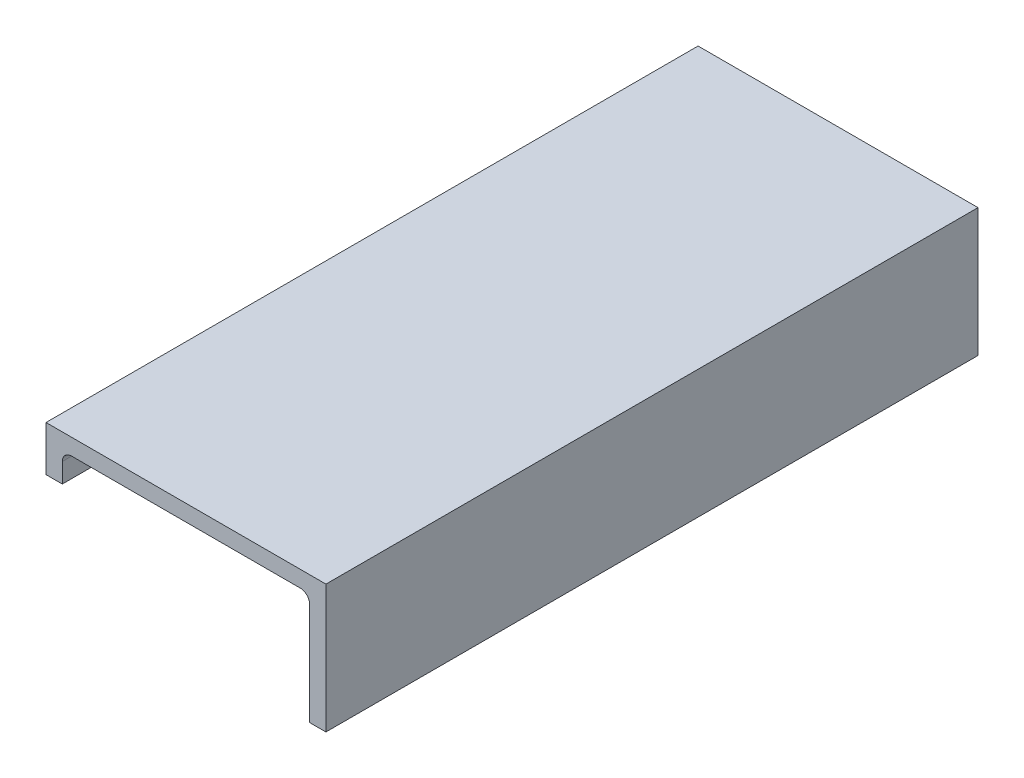
ISO-10303-21;
HEADER;
FILE_DESCRIPTION(('STEP AP214'),'2;1');
FILE_NAME('part.step','',(''),(''),'','','');
FILE_SCHEMA(('AUTOMOTIVE_DESIGN { 1 0 10303 214 1 1 1 1 }'));
ENDSEC;
DATA;
#1=APPLICATION_CONTEXT('core data for automotive mechanical design processes');
#2=APPLICATION_PROTOCOL_DEFINITION('international standard','automotive_design',2000,#1);
#3=PRODUCT_CONTEXT('',#1,'mechanical');
#4=PRODUCT('Part','Part','',(#3));
#5=PRODUCT_RELATED_PRODUCT_CATEGORY('part','',(#4));
#6=PRODUCT_DEFINITION_FORMATION('','',#4);
#7=PRODUCT_DEFINITION_CONTEXT('part definition',#1,'design');
#8=PRODUCT_DEFINITION('design','',#6,#7);
#9=PRODUCT_DEFINITION_SHAPE('','',#8);
#10=(LENGTH_UNIT() NAMED_UNIT(*) SI_UNIT(.MILLI.,.METRE.));
#11=(NAMED_UNIT(*) PLANE_ANGLE_UNIT() SI_UNIT($,.RADIAN.));
#12=(NAMED_UNIT(*) SI_UNIT($,.STERADIAN.) SOLID_ANGLE_UNIT());
#13=UNCERTAINTY_MEASURE_WITH_UNIT(LENGTH_MEASURE(1.E-05),#10,'distance_accuracy_value','');
#14=(GEOMETRIC_REPRESENTATION_CONTEXT(3) GLOBAL_UNCERTAINTY_ASSIGNED_CONTEXT((#13)) GLOBAL_UNIT_ASSIGNED_CONTEXT((#10,
#11,#12)) REPRESENTATION_CONTEXT('',''));
#15=CARTESIAN_POINT('',(0.,0.,0.));
#16=DIRECTION('',(0.,0.,1.));
#17=DIRECTION('',(1.,0.,0.));
#18=AXIS2_PLACEMENT_3D('',#15,#16,#17);
#19=CARTESIAN_POINT('',(-38.1635,0.,177.8));
#20=DIRECTION('',(1.,0.,0.));
#21=DIRECTION('',(0.,0.,-1.));
#22=AXIS2_PLACEMENT_3D('',#19,#20,#21);
#23=PLANE('',#22);
#24=DIRECTION('',(0.,-1.,0.));
#25=VECTOR('',#24,1.);
#26=CARTESIAN_POINT('',(-38.1635,0.,0.));
#27=LINE('',#26,#25);
#28=CARTESIAN_POINT('',(-38.1635,0.,0.));
#29=VERTEX_POINT('',#28);
#30=CARTESIAN_POINT('',(-38.1635,-12.319,0.));
#31=VERTEX_POINT('',#30);
#32=EDGE_CURVE('E189',#29,#31,#27,.T.);
#33=ORIENTED_EDGE('',*,*,#32,.T.);
#34=DIRECTION('',(0.,0.,-1.));
#35=VECTOR('',#34,1.);
#36=CARTESIAN_POINT('',(-38.1635,-12.319,177.8));
#37=LINE('',#36,#35);
#38=CARTESIAN_POINT('',(-38.1635,-12.319,177.8));
#39=VERTEX_POINT('',#38);
#40=EDGE_CURVE('E115',#39,#31,#37,.T.);
#41=ORIENTED_EDGE('',*,*,#40,.F.);
#42=DIRECTION('',(0.,-1.,0.));
#43=VECTOR('',#42,1.);
#44=CARTESIAN_POINT('',(-38.1635,0.,177.8));
#45=LINE('',#44,#43);
#46=CARTESIAN_POINT('',(-38.1635,0.,177.8));
#47=VERTEX_POINT('',#46);
#48=EDGE_CURVE('E110',#47,#39,#45,.T.);
#49=ORIENTED_EDGE('',*,*,#48,.F.);
#50=DIRECTION('',(0.,0.,-1.));
#51=VECTOR('',#50,1.);
#52=CARTESIAN_POINT('',(-38.1635,0.,177.8));
#53=LINE('',#52,#51);
#54=EDGE_CURVE('E113',#47,#29,#53,.T.);
#55=ORIENTED_EDGE('',*,*,#54,.T.);
#56=EDGE_LOOP('',(#33,#41,#49,#55));
#57=FACE_BOUND('',#56,.T.);
#58=ADVANCED_FACE('F33',(#57),#23,.F.);
#59=CARTESIAN_POINT('',(-38.1635,-12.319,177.8));
#60=DIRECTION('',(0.,1.,0.));
#61=DIRECTION('',(0.,0.,1.));
#62=AXIS2_PLACEMENT_3D('',#59,#60,#61);
#63=PLANE('',#62);
#64=DIRECTION('',(1.,0.,0.));
#65=VECTOR('',#64,1.);
#66=CARTESIAN_POINT('',(-38.1635,-12.319,0.));
#67=LINE('',#66,#65);
#68=CARTESIAN_POINT('',(-33.7185,-12.319,0.));
#69=VERTEX_POINT('',#68);
#70=EDGE_CURVE('E168',#31,#69,#67,.T.);
#71=ORIENTED_EDGE('',*,*,#70,.T.);
#72=DIRECTION('',(0.,0.,-1.));
#73=VECTOR('',#72,1.);
#74=CARTESIAN_POINT('',(-33.7185,-12.319,177.8));
#75=LINE('',#74,#73);
#76=CARTESIAN_POINT('',(-33.7185,-12.319,177.8));
#77=VERTEX_POINT('',#76);
#78=EDGE_CURVE('E138',#77,#69,#75,.T.);
#79=ORIENTED_EDGE('',*,*,#78,.F.);
#80=DIRECTION('',(1.,0.,0.));
#81=VECTOR('',#80,1.);
#82=CARTESIAN_POINT('',(-38.1635,-12.319,177.8));
#83=LINE('',#82,#81);
#84=EDGE_CURVE('E118',#39,#77,#83,.T.);
#85=ORIENTED_EDGE('',*,*,#84,.F.);
#86=ORIENTED_EDGE('',*,*,#40,.T.);
#87=EDGE_LOOP('',(#71,#79,#85,#86));
#88=FACE_BOUND('',#87,.T.);
#89=ADVANCED_FACE('F199',(#88),#63,.F.);
#90=CARTESIAN_POINT('',(-33.7185,-4.445,177.8));
#91=DIRECTION('',(-1.,0.,0.));
#92=DIRECTION('',(0.,0.,1.));
#93=AXIS2_PLACEMENT_3D('',#90,#91,#92);
#94=PLANE('',#93);
#95=DIRECTION('',(0.,1.,0.));
#96=VECTOR('',#95,1.);
#97=CARTESIAN_POINT('',(-33.7185,-4.445,0.));
#98=LINE('',#97,#96);
#99=CARTESIAN_POINT('',(-33.7185,-6.985,0.));
#100=VERTEX_POINT('',#99);
#101=EDGE_CURVE('E164',#69,#100,#98,.T.);
#102=ORIENTED_EDGE('',*,*,#101,.T.);
#103=DIRECTION('',(0.,0.,-1.));
#104=VECTOR('',#103,1.);
#105=CARTESIAN_POINT('',(-33.7185,-6.985,177.8));
#106=LINE('',#105,#104);
#107=CARTESIAN_POINT('',(-33.7185,-6.985,177.8));
#108=VERTEX_POINT('',#107);
#109=EDGE_CURVE('E48',#100,#108,#106,.F.);
#110=ORIENTED_EDGE('',*,*,#109,.T.);
#111=DIRECTION('',(0.,1.,0.));
#112=VECTOR('',#111,1.);
#113=CARTESIAN_POINT('',(-33.7185,-4.445,177.8));
#114=LINE('',#113,#112);
#115=EDGE_CURVE('E186',#77,#108,#114,.T.);
#116=ORIENTED_EDGE('',*,*,#115,.F.);
#117=ORIENTED_EDGE('',*,*,#78,.T.);
#118=EDGE_LOOP('',(#102,#110,#116,#117));
#119=FACE_BOUND('',#118,.T.);
#120=ADVANCED_FACE('F185',(#119),#94,.F.);
#121=CARTESIAN_POINT('',(33.7185,-4.44499999999999,177.8));
#122=DIRECTION('',(0.,1.,0.));
#123=DIRECTION('',(-1.,0.,0.));
#124=AXIS2_PLACEMENT_3D('',#121,#122,#123);
#125=PLANE('',#124);
#126=DIRECTION('',(1.,0.,0.));
#127=VECTOR('',#126,1.);
#128=CARTESIAN_POINT('',(33.7185,-4.44499999999999,177.8));
#129=LINE('',#128,#127);
#130=CARTESIAN_POINT('',(-31.1785,-4.445,177.8));
#131=VERTEX_POINT('',#130);
#132=CARTESIAN_POINT('',(31.1785,-4.44499999999999,177.8));
#133=VERTEX_POINT('',#132);
#134=EDGE_CURVE('E157',#131,#133,#129,.T.);
#135=ORIENTED_EDGE('',*,*,#134,.F.);
#136=DIRECTION('',(0.,0.,-1.));
#137=VECTOR('',#136,1.);
#138=CARTESIAN_POINT('',(-31.1785,-4.445,0.));
#139=LINE('',#138,#137);
#140=CARTESIAN_POINT('',(-31.1785,-4.445,0.));
#141=VERTEX_POINT('',#140);
#142=EDGE_CURVE('E149',#131,#141,#139,.T.);
#143=ORIENTED_EDGE('',*,*,#142,.T.);
#144=DIRECTION('',(1.,0.,0.));
#145=VECTOR('',#144,1.);
#146=CARTESIAN_POINT('',(33.7185,-4.44499999999999,0.));
#147=LINE('',#146,#145);
#148=CARTESIAN_POINT('',(31.1785,-4.44499999999999,0.));
#149=VERTEX_POINT('',#148);
#150=EDGE_CURVE('E156',#141,#149,#147,.T.);
#151=ORIENTED_EDGE('',*,*,#150,.T.);
#152=DIRECTION('',(0.,0.,-1.));
#153=VECTOR('',#152,1.);
#154=CARTESIAN_POINT('',(31.1785,-4.44499999999999,177.8));
#155=LINE('',#154,#153);
#156=EDGE_CURVE('E136',#149,#133,#155,.F.);
#157=ORIENTED_EDGE('',*,*,#156,.T.);
#158=EDGE_LOOP('',(#135,#143,#151,#157));
#159=FACE_BOUND('',#158,.T.);
#160=ADVANCED_FACE('F155',(#159),#125,.F.);
#161=CARTESIAN_POINT('',(33.7185,-34.925,177.8));
#162=DIRECTION('',(1.,0.,0.));
#163=DIRECTION('',(0.,0.,-1.));
#164=AXIS2_PLACEMENT_3D('',#161,#162,#163);
#165=PLANE('',#164);
#166=DIRECTION('',(0.,-1.,0.));
#167=VECTOR('',#166,1.);
#168=CARTESIAN_POINT('',(33.7185,-34.925,177.8));
#169=LINE('',#168,#167);
#170=CARTESIAN_POINT('',(33.7185,-6.985,177.8));
#171=VERTEX_POINT('',#170);
#172=CARTESIAN_POINT('',(33.7185,-34.925,177.8));
#173=VERTEX_POINT('',#172);
#174=EDGE_CURVE('E195',#171,#173,#169,.T.);
#175=ORIENTED_EDGE('',*,*,#174,.F.);
#176=DIRECTION('',(0.,0.,-1.));
#177=VECTOR('',#176,1.);
#178=CARTESIAN_POINT('',(33.7185,-6.98499999999999,0.));
#179=LINE('',#178,#177);
#180=CARTESIAN_POINT('',(33.7185,-6.985,0.));
#181=VERTEX_POINT('',#180);
#182=EDGE_CURVE('E133',#171,#181,#179,.T.);
#183=ORIENTED_EDGE('',*,*,#182,.T.);
#184=DIRECTION('',(0.,-1.,0.));
#185=VECTOR('',#184,1.);
#186=CARTESIAN_POINT('',(33.7185,-34.925,0.));
#187=LINE('',#186,#185);
#188=CARTESIAN_POINT('',(33.7185,-34.925,0.));
#189=VERTEX_POINT('',#188);
#190=EDGE_CURVE('E163',#181,#189,#187,.T.);
#191=ORIENTED_EDGE('',*,*,#190,.T.);
#192=DIRECTION('',(0.,0.,-1.));
#193=VECTOR('',#192,1.);
#194=CARTESIAN_POINT('',(33.7185,-34.925,177.8));
#195=LINE('',#194,#193);
#196=EDGE_CURVE('E181',#173,#189,#195,.T.);
#197=ORIENTED_EDGE('',*,*,#196,.F.);
#198=EDGE_LOOP('',(#175,#183,#191,#197));
#199=FACE_BOUND('',#198,.T.);
#200=ADVANCED_FACE('F222',(#199),#165,.F.);
#201=CARTESIAN_POINT('',(38.1635,-34.925,177.8));
#202=DIRECTION('',(0.,1.,0.));
#203=DIRECTION('',(0.,0.,1.));
#204=AXIS2_PLACEMENT_3D('',#201,#202,#203);
#205=PLANE('',#204);
#206=DIRECTION('',(1.,0.,0.));
#207=VECTOR('',#206,1.);
#208=CARTESIAN_POINT('',(38.1635,-34.925,0.));
#209=LINE('',#208,#207);
#210=CARTESIAN_POINT('',(38.1635,-34.925,0.));
#211=VERTEX_POINT('',#210);
#212=EDGE_CURVE('E166',#189,#211,#209,.T.);
#213=ORIENTED_EDGE('',*,*,#212,.T.);
#214=DIRECTION('',(0.,0.,-1.));
#215=VECTOR('',#214,1.);
#216=CARTESIAN_POINT('',(38.1635,-34.925,177.8));
#217=LINE('',#216,#215);
#218=CARTESIAN_POINT('',(38.1635,-34.925,177.8));
#219=VERTEX_POINT('',#218);
#220=EDGE_CURVE('E178',#219,#211,#217,.T.);
#221=ORIENTED_EDGE('',*,*,#220,.F.);
#222=DIRECTION('',(1.,0.,0.));
#223=VECTOR('',#222,1.);
#224=CARTESIAN_POINT('',(38.1635,-34.925,177.8));
#225=LINE('',#224,#223);
#226=EDGE_CURVE('E193',#173,#219,#225,.T.);
#227=ORIENTED_EDGE('',*,*,#226,.F.);
#228=ORIENTED_EDGE('',*,*,#196,.T.);
#229=EDGE_LOOP('',(#213,#221,#227,#228));
#230=FACE_BOUND('',#229,.T.);
#231=ADVANCED_FACE('F227',(#230),#205,.F.);
#232=CARTESIAN_POINT('',(38.1635,0.,177.8));
#233=DIRECTION('',(-1.,0.,0.));
#234=DIRECTION('',(0.,0.,1.));
#235=AXIS2_PLACEMENT_3D('',#232,#233,#234);
#236=PLANE('',#235);
#237=DIRECTION('',(0.,1.,0.));
#238=VECTOR('',#237,1.);
#239=CARTESIAN_POINT('',(38.1635,0.,0.));
#240=LINE('',#239,#238);
#241=CARTESIAN_POINT('',(38.1635,0.,0.));
#242=VERTEX_POINT('',#241);
#243=EDGE_CURVE('E173',#211,#242,#240,.T.);
#244=ORIENTED_EDGE('',*,*,#243,.T.);
#245=DIRECTION('',(0.,0.,-1.));
#246=VECTOR('',#245,1.);
#247=CARTESIAN_POINT('',(38.1635,0.,177.8));
#248=LINE('',#247,#246);
#249=CARTESIAN_POINT('',(38.1635,0.,177.8));
#250=VERTEX_POINT('',#249);
#251=EDGE_CURVE('E176',#250,#242,#248,.T.);
#252=ORIENTED_EDGE('',*,*,#251,.F.);
#253=DIRECTION('',(0.,1.,0.));
#254=VECTOR('',#253,1.);
#255=CARTESIAN_POINT('',(38.1635,0.,177.8));
#256=LINE('',#255,#254);
#257=EDGE_CURVE('E124',#219,#250,#256,.T.);
#258=ORIENTED_EDGE('',*,*,#257,.F.);
#259=ORIENTED_EDGE('',*,*,#220,.T.);
#260=EDGE_LOOP('',(#244,#252,#258,#259));
#261=FACE_BOUND('',#260,.T.);
#262=ADVANCED_FACE('F230',(#261),#236,.F.);
#263=CARTESIAN_POINT('',(0.,0.,177.8));
#264=DIRECTION('',(0.,-1.,0.));
#265=DIRECTION('',(0.,0.,-1.));
#266=AXIS2_PLACEMENT_3D('',#263,#264,#265);
#267=PLANE('',#266);
#268=DIRECTION('',(-1.,0.,0.));
#269=VECTOR('',#268,1.);
#270=CARTESIAN_POINT('',(0.,0.,0.));
#271=LINE('',#270,#269);
#272=EDGE_CURVE('E128',#242,#29,#271,.T.);
#273=ORIENTED_EDGE('',*,*,#272,.T.);
#274=ORIENTED_EDGE('',*,*,#54,.F.);
#275=DIRECTION('',(-1.,0.,0.));
#276=VECTOR('',#275,1.);
#277=CARTESIAN_POINT('',(0.,0.,177.8));
#278=LINE('',#277,#276);
#279=EDGE_CURVE('E119',#250,#47,#278,.T.);
#280=ORIENTED_EDGE('',*,*,#279,.F.);
#281=ORIENTED_EDGE('',*,*,#251,.T.);
#282=EDGE_LOOP('',(#273,#274,#280,#281));
#283=FACE_BOUND('',#282,.T.);
#284=ADVANCED_FACE('F130',(#283),#267,.F.);
#285=CARTESIAN_POINT('',(0.,0.,177.8));
#286=DIRECTION('',(0.,0.,1.));
#287=DIRECTION('',(1.,0.,0.));
#288=AXIS2_PLACEMENT_3D('',#285,#286,#287);
#289=PLANE('',#288);
#290=ORIENTED_EDGE('',*,*,#279,.T.);
#291=ORIENTED_EDGE('',*,*,#48,.T.);
#292=ORIENTED_EDGE('',*,*,#84,.T.);
#293=ORIENTED_EDGE('',*,*,#115,.T.);
#294=CARTESIAN_POINT('',(-31.1785,-6.985,177.8));
#295=DIRECTION('',(0.,0.,1.));
#296=DIRECTION('',(1.,0.,0.));
#297=AXIS2_PLACEMENT_3D('',#294,#295,#296);
#298=CIRCLE('',#297,2.54);
#299=EDGE_CURVE('E11',#108,#131,#298,.F.);
#300=ORIENTED_EDGE('',*,*,#299,.T.);
#301=ORIENTED_EDGE('',*,*,#134,.T.);
#302=CARTESIAN_POINT('',(31.1785,-6.98499999999999,177.8));
#303=DIRECTION('',(0.,0.,1.));
#304=DIRECTION('',(1.,0.,0.));
#305=AXIS2_PLACEMENT_3D('',#302,#303,#304);
#306=CIRCLE('',#305,2.54);
#307=EDGE_CURVE('E147',#133,#171,#306,.F.);
#308=ORIENTED_EDGE('',*,*,#307,.T.);
#309=ORIENTED_EDGE('',*,*,#174,.T.);
#310=ORIENTED_EDGE('',*,*,#226,.T.);
#311=ORIENTED_EDGE('',*,*,#257,.T.);
#312=EDGE_LOOP('',(#290,#291,#292,#293,#300,#301,#308,#309,#310,#311));
#313=FACE_BOUND('',#312,.T.);
#314=ADVANCED_FACE('F122',(#313),#289,.T.);
#315=CARTESIAN_POINT('',(0.,0.,0.));
#316=DIRECTION('',(0.,0.,1.));
#317=DIRECTION('',(1.,0.,0.));
#318=AXIS2_PLACEMENT_3D('',#315,#316,#317);
#319=PLANE('',#318);
#320=ORIENTED_EDGE('',*,*,#32,.F.);
#321=ORIENTED_EDGE('',*,*,#272,.F.);
#322=ORIENTED_EDGE('',*,*,#243,.F.);
#323=ORIENTED_EDGE('',*,*,#212,.F.);
#324=ORIENTED_EDGE('',*,*,#190,.F.);
#325=CARTESIAN_POINT('',(31.1785,-6.98499999999999,0.));
#326=DIRECTION('',(0.,0.,1.));
#327=DIRECTION('',(1.,0.,0.));
#328=AXIS2_PLACEMENT_3D('',#325,#326,#327);
#329=CIRCLE('',#328,2.54);
#330=EDGE_CURVE('E144',#181,#149,#329,.T.);
#331=ORIENTED_EDGE('',*,*,#330,.T.);
#332=ORIENTED_EDGE('',*,*,#150,.F.);
#333=CARTESIAN_POINT('',(-31.1785,-6.985,0.));
#334=DIRECTION('',(0.,0.,1.));
#335=DIRECTION('',(1.,0.,0.));
#336=AXIS2_PLACEMENT_3D('',#333,#334,#335);
#337=CIRCLE('',#336,2.54);
#338=EDGE_CURVE('E41',#141,#100,#337,.T.);
#339=ORIENTED_EDGE('',*,*,#338,.T.);
#340=ORIENTED_EDGE('',*,*,#101,.F.);
#341=ORIENTED_EDGE('',*,*,#70,.F.);
#342=EDGE_LOOP('',(#320,#321,#322,#323,#324,#331,#332,#339,#340,#341));
#343=FACE_BOUND('',#342,.T.);
#344=ADVANCED_FACE('F160',(#343),#319,.F.);
#345=CARTESIAN_POINT('',(31.1785,-6.98499999999999,177.8));
#346=DIRECTION('',(0.,0.,1.));
#347=DIRECTION('',(1.,0.,0.));
#348=AXIS2_PLACEMENT_3D('',#345,#346,#347);
#349=CYLINDRICAL_SURFACE('',#348,2.54);
#350=ORIENTED_EDGE('',*,*,#307,.F.);
#351=ORIENTED_EDGE('',*,*,#156,.F.);
#352=ORIENTED_EDGE('',*,*,#330,.F.);
#353=ORIENTED_EDGE('',*,*,#182,.F.);
#354=EDGE_LOOP('',(#350,#351,#352,#353));
#355=FACE_BOUND('',#354,.T.);
#356=ADVANCED_FACE('F209',(#355),#349,.F.);
#357=CARTESIAN_POINT('',(-31.1785,-6.985,177.8));
#358=DIRECTION('',(0.,0.,1.));
#359=DIRECTION('',(1.,0.,0.));
#360=AXIS2_PLACEMENT_3D('',#357,#358,#359);
#361=CYLINDRICAL_SURFACE('',#360,2.54);
#362=ORIENTED_EDGE('',*,*,#299,.F.);
#363=ORIENTED_EDGE('',*,*,#109,.F.);
#364=ORIENTED_EDGE('',*,*,#338,.F.);
#365=ORIENTED_EDGE('',*,*,#142,.F.);
#366=EDGE_LOOP('',(#362,#363,#364,#365));
#367=FACE_BOUND('',#366,.T.);
#368=ADVANCED_FACE('F35',(#367),#361,.F.);
#369=CLOSED_SHELL('',(#58,#89,#120,#160,#200,#231,#262,#284,#314,#344,#356,#368));
#370=MANIFOLD_SOLID_BREP('B2',#369);
#371=ADVANCED_BREP_SHAPE_REPRESENTATION('',(#18,#370),#14);
#372=SHAPE_DEFINITION_REPRESENTATION(#9,#371);
ENDSEC;
END-ISO-10303-21;
